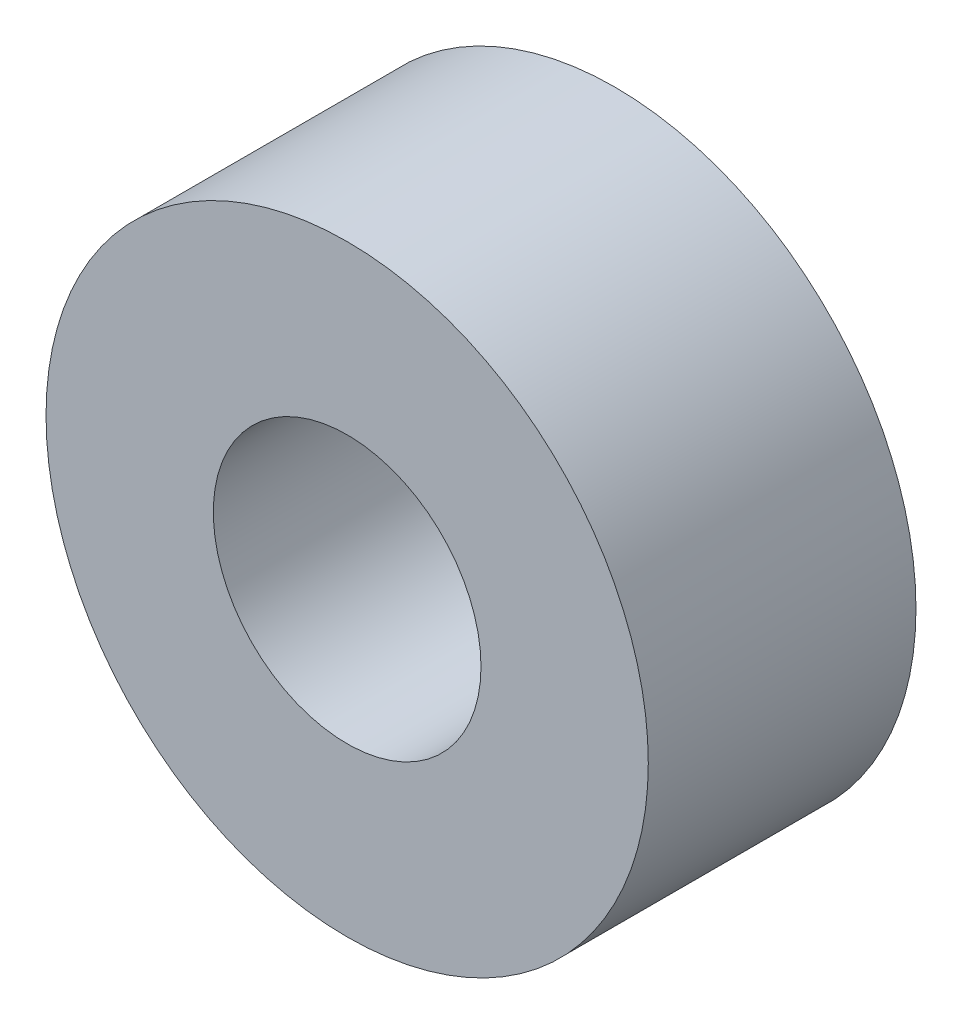
ISO-10303-21;
HEADER;
FILE_DESCRIPTION(('STEP AP214'),'2;1');
FILE_NAME('part.step','',(''),(''),'','','');
FILE_SCHEMA(('AUTOMOTIVE_DESIGN { 1 0 10303 214 1 1 1 1 }'));
ENDSEC;
DATA;
#1=APPLICATION_CONTEXT('core data for automotive mechanical design processes');
#2=APPLICATION_PROTOCOL_DEFINITION('international standard','automotive_design',2000,#1);
#3=PRODUCT_CONTEXT('',#1,'mechanical');
#4=PRODUCT('Part','Part','',(#3));
#5=PRODUCT_RELATED_PRODUCT_CATEGORY('part','',(#4));
#6=PRODUCT_DEFINITION_FORMATION('','',#4);
#7=PRODUCT_DEFINITION_CONTEXT('part definition',#1,'design');
#8=PRODUCT_DEFINITION('design','',#6,#7);
#9=PRODUCT_DEFINITION_SHAPE('','',#8);
#10=(LENGTH_UNIT() NAMED_UNIT(*) SI_UNIT(.MILLI.,.METRE.));
#11=(NAMED_UNIT(*) PLANE_ANGLE_UNIT() SI_UNIT($,.RADIAN.));
#12=(NAMED_UNIT(*) SI_UNIT($,.STERADIAN.) SOLID_ANGLE_UNIT());
#13=UNCERTAINTY_MEASURE_WITH_UNIT(LENGTH_MEASURE(1.E-05),#10,'distance_accuracy_value','');
#14=(GEOMETRIC_REPRESENTATION_CONTEXT(3) GLOBAL_UNCERTAINTY_ASSIGNED_CONTEXT((#13)) GLOBAL_UNIT_ASSIGNED_CONTEXT((#10,
#11,#12)) REPRESENTATION_CONTEXT('',''));
#15=CARTESIAN_POINT('',(0.,0.,0.));
#16=DIRECTION('',(0.,0.,1.));
#17=DIRECTION('',(1.,0.,0.));
#18=AXIS2_PLACEMENT_3D('',#15,#16,#17);
#19=CARTESIAN_POINT('',(0.,0.,4.));
#20=DIRECTION('',(0.,0.,1.));
#21=DIRECTION('',(1.,0.,0.));
#22=AXIS2_PLACEMENT_3D('',#19,#20,#21);
#23=PLANE('',#22);
#24=CARTESIAN_POINT('',(0.,0.,4.));
#25=DIRECTION('',(0.,0.,1.));
#26=DIRECTION('',(1.,0.,0.));
#27=AXIS2_PLACEMENT_3D('',#24,#25,#26);
#28=CIRCLE('',#27,4.5);
#29=CARTESIAN_POINT('',(4.5,0.,4.));
#30=VERTEX_POINT('',#29);
#31=EDGE_CURVE('E10',#30,#30,#28,.T.);
#32=ORIENTED_EDGE('',*,*,#31,.T.);
#33=EDGE_LOOP('',(#32));
#34=FACE_BOUND('',#33,.T.);
#35=CARTESIAN_POINT('',(0.,0.,4.));
#36=DIRECTION('',(0.,0.,1.));
#37=DIRECTION('',(1.,0.,0.));
#38=AXIS2_PLACEMENT_3D('',#35,#36,#37);
#39=CIRCLE('',#38,2.);
#40=CARTESIAN_POINT('',(2.,0.,4.));
#41=VERTEX_POINT('',#40);
#42=EDGE_CURVE('E45',#41,#41,#39,.T.);
#43=ORIENTED_EDGE('',*,*,#42,.F.);
#44=EDGE_LOOP('',(#43));
#45=FACE_BOUND('',#44,.T.);
#46=ADVANCED_FACE('F34',(#34,#45),#23,.T.);
#47=CARTESIAN_POINT('',(0.,0.,0.));
#48=DIRECTION('',(0.,0.,1.));
#49=DIRECTION('',(1.,0.,0.));
#50=AXIS2_PLACEMENT_3D('',#47,#48,#49);
#51=PLANE('',#50);
#52=CARTESIAN_POINT('',(0.,0.,0.));
#53=DIRECTION('',(0.,0.,1.));
#54=DIRECTION('',(1.,0.,0.));
#55=AXIS2_PLACEMENT_3D('',#52,#53,#54);
#56=CIRCLE('',#55,4.5);
#57=CARTESIAN_POINT('',(4.5,0.,0.));
#58=VERTEX_POINT('',#57);
#59=EDGE_CURVE('E38',#58,#58,#56,.T.);
#60=ORIENTED_EDGE('',*,*,#59,.F.);
#61=EDGE_LOOP('',(#60));
#62=FACE_BOUND('',#61,.T.);
#63=CARTESIAN_POINT('',(0.,0.,0.));
#64=DIRECTION('',(0.,0.,1.));
#65=DIRECTION('',(1.,0.,0.));
#66=AXIS2_PLACEMENT_3D('',#63,#64,#65);
#67=CIRCLE('',#66,2.);
#68=CARTESIAN_POINT('',(2.,0.,0.));
#69=VERTEX_POINT('',#68);
#70=EDGE_CURVE('E47',#69,#69,#67,.T.);
#71=ORIENTED_EDGE('',*,*,#70,.T.);
#72=EDGE_LOOP('',(#71));
#73=FACE_BOUND('',#72,.T.);
#74=ADVANCED_FACE('F57',(#62,#73),#51,.F.);
#75=CARTESIAN_POINT('',(0.,0.,4.));
#76=DIRECTION('',(0.,0.,-1.));
#77=DIRECTION('',(-1.,0.,0.));
#78=AXIS2_PLACEMENT_3D('',#75,#76,#77);
#79=CYLINDRICAL_SURFACE('',#78,4.5);
#80=ORIENTED_EDGE('',*,*,#31,.F.);
#81=EDGE_LOOP('',(#80));
#82=FACE_BOUND('',#81,.T.);
#83=ORIENTED_EDGE('',*,*,#59,.T.);
#84=EDGE_LOOP('',(#83));
#85=FACE_BOUND('',#84,.T.);
#86=ADVANCED_FACE('F36',(#82,#85),#79,.T.);
#87=CARTESIAN_POINT('',(0.,0.,4.));
#88=DIRECTION('',(0.,0.,-1.));
#89=DIRECTION('',(-1.,0.,0.));
#90=AXIS2_PLACEMENT_3D('',#87,#88,#89);
#91=CYLINDRICAL_SURFACE('',#90,2.);
#92=ORIENTED_EDGE('',*,*,#42,.T.);
#93=EDGE_LOOP('',(#92));
#94=FACE_BOUND('',#93,.T.);
#95=ORIENTED_EDGE('',*,*,#70,.F.);
#96=EDGE_LOOP('',(#95));
#97=FACE_BOUND('',#96,.T.);
#98=ADVANCED_FACE('F53',(#94,#97),#91,.F.);
#99=CLOSED_SHELL('',(#46,#74,#86,#98));
#100=MANIFOLD_SOLID_BREP('B2',#99);
#101=ADVANCED_BREP_SHAPE_REPRESENTATION('',(#18,#100),#14);
#102=SHAPE_DEFINITION_REPRESENTATION(#9,#101);
ENDSEC;
END-ISO-10303-21;
